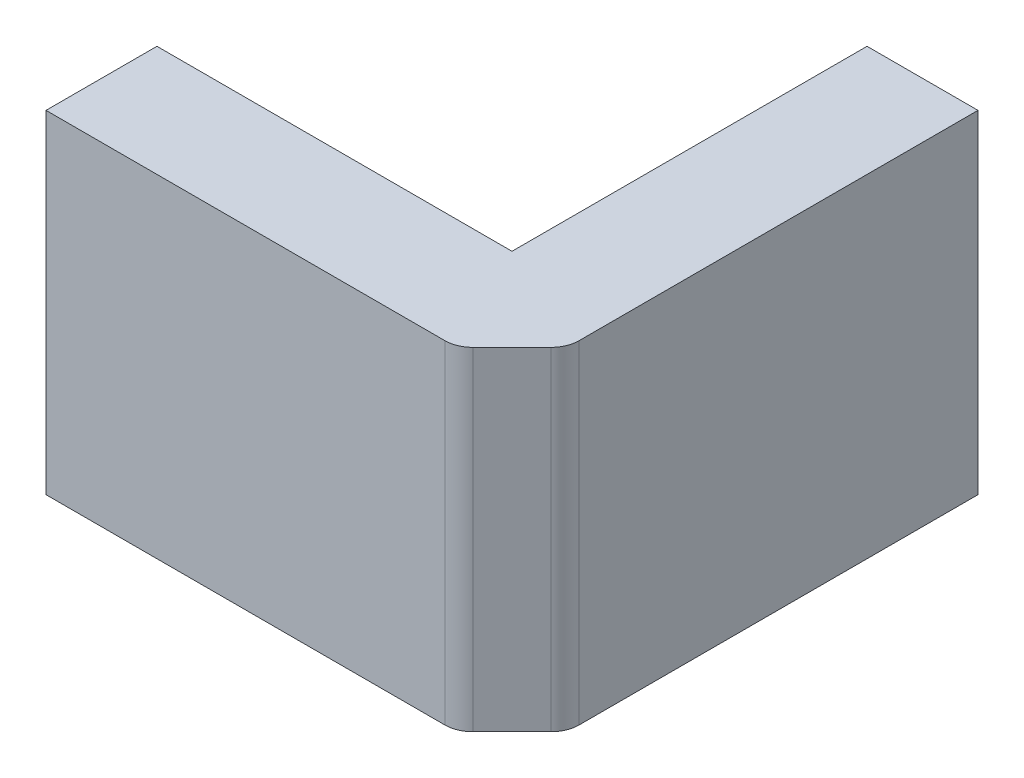
ISO-10303-21;
HEADER;
FILE_DESCRIPTION(('STEP AP214'),'2;1');
FILE_NAME('part.step','',(''),(''),'','','');
FILE_SCHEMA(('AUTOMOTIVE_DESIGN { 1 0 10303 214 1 1 1 1 }'));
ENDSEC;
DATA;
#1=APPLICATION_CONTEXT('core data for automotive mechanical design processes');
#2=APPLICATION_PROTOCOL_DEFINITION('international standard','automotive_design',2000,#1);
#3=PRODUCT_CONTEXT('',#1,'mechanical');
#4=PRODUCT('Part','Part','',(#3));
#5=PRODUCT_RELATED_PRODUCT_CATEGORY('part','',(#4));
#6=PRODUCT_DEFINITION_FORMATION('','',#4);
#7=PRODUCT_DEFINITION_CONTEXT('part definition',#1,'design');
#8=PRODUCT_DEFINITION('design','',#6,#7);
#9=PRODUCT_DEFINITION_SHAPE('','',#8);
#10=(LENGTH_UNIT() NAMED_UNIT(*) SI_UNIT(.MILLI.,.METRE.));
#11=(NAMED_UNIT(*) PLANE_ANGLE_UNIT() SI_UNIT($,.RADIAN.));
#12=(NAMED_UNIT(*) SI_UNIT($,.STERADIAN.) SOLID_ANGLE_UNIT());
#13=UNCERTAINTY_MEASURE_WITH_UNIT(LENGTH_MEASURE(1.E-05),#10,'distance_accuracy_value','');
#14=(GEOMETRIC_REPRESENTATION_CONTEXT(3) GLOBAL_UNCERTAINTY_ASSIGNED_CONTEXT((#13)) GLOBAL_UNIT_ASSIGNED_CONTEXT((#10,
#11,#12)) REPRESENTATION_CONTEXT('',''));
#15=CARTESIAN_POINT('',(0.,0.,0.));
#16=DIRECTION('',(0.,0.,1.));
#17=DIRECTION('',(1.,0.,0.));
#18=AXIS2_PLACEMENT_3D('',#15,#16,#17);
#19=CARTESIAN_POINT('',(42.,60.,42.));
#20=DIRECTION('',(-1.,0.,0.));
#21=DIRECTION('',(0.,0.,1.));
#22=AXIS2_PLACEMENT_3D('',#19,#20,#21);
#23=PLANE('',#22);
#24=DIRECTION('',(0.,0.,-1.));
#25=VECTOR('',#24,1.);
#26=CARTESIAN_POINT('',(42.,60.,42.));
#27=LINE('',#26,#25);
#28=CARTESIAN_POINT('',(42.,60.,29.9289321881345));
#29=VERTEX_POINT('',#28);
#30=CARTESIAN_POINT('',(42.,60.,-42.));
#31=VERTEX_POINT('',#30);
#32=EDGE_CURVE('E111',#29,#31,#27,.T.);
#33=ORIENTED_EDGE('',*,*,#32,.F.);
#34=DIRECTION('',(0.,1.,0.));
#35=VECTOR('',#34,1.);
#36=CARTESIAN_POINT('',(42.,0.,29.9289321881345));
#37=LINE('',#36,#35);
#38=CARTESIAN_POINT('',(42.,0.,29.9289321881345));
#39=VERTEX_POINT('',#38);
#40=EDGE_CURVE('E145',#29,#39,#37,.F.);
#41=ORIENTED_EDGE('',*,*,#40,.T.);
#42=DIRECTION('',(0.,0.,-1.));
#43=VECTOR('',#42,1.);
#44=CARTESIAN_POINT('',(42.,0.,42.));
#45=LINE('',#44,#43);
#46=CARTESIAN_POINT('',(42.,0.,-42.));
#47=VERTEX_POINT('',#46);
#48=EDGE_CURVE('E133',#39,#47,#45,.T.);
#49=ORIENTED_EDGE('',*,*,#48,.T.);
#50=DIRECTION('',(0.,-1.,0.));
#51=VECTOR('',#50,1.);
#52=CARTESIAN_POINT('',(42.,60.,-42.));
#53=LINE('',#52,#51);
#54=EDGE_CURVE('E126',#31,#47,#53,.T.);
#55=ORIENTED_EDGE('',*,*,#54,.F.);
#56=EDGE_LOOP('',(#33,#41,#49,#55));
#57=FACE_BOUND('',#56,.T.);
#58=ADVANCED_FACE('F39',(#57),#23,.F.);
#59=CARTESIAN_POINT('',(22.,60.,-42.));
#60=DIRECTION('',(0.,0.,1.));
#61=DIRECTION('',(1.,0.,0.));
#62=AXIS2_PLACEMENT_3D('',#59,#60,#61);
#63=PLANE('',#62);
#64=DIRECTION('',(-1.,0.,0.));
#65=VECTOR('',#64,1.);
#66=CARTESIAN_POINT('',(22.,0.,-42.));
#67=LINE('',#66,#65);
#68=CARTESIAN_POINT('',(22.,0.,-42.));
#69=VERTEX_POINT('',#68);
#70=EDGE_CURVE('E189',#47,#69,#67,.T.);
#71=ORIENTED_EDGE('',*,*,#70,.T.);
#72=DIRECTION('',(0.,-1.,0.));
#73=VECTOR('',#72,1.);
#74=CARTESIAN_POINT('',(22.,60.,-42.));
#75=LINE('',#74,#73);
#76=CARTESIAN_POINT('',(22.,60.,-42.));
#77=VERTEX_POINT('',#76);
#78=EDGE_CURVE('E128',#77,#69,#75,.T.);
#79=ORIENTED_EDGE('',*,*,#78,.F.);
#80=DIRECTION('',(-1.,0.,0.));
#81=VECTOR('',#80,1.);
#82=CARTESIAN_POINT('',(22.,60.,-42.));
#83=LINE('',#82,#81);
#84=EDGE_CURVE('E114',#31,#77,#83,.T.);
#85=ORIENTED_EDGE('',*,*,#84,.F.);
#86=ORIENTED_EDGE('',*,*,#54,.T.);
#87=EDGE_LOOP('',(#71,#79,#85,#86));
#88=FACE_BOUND('',#87,.T.);
#89=ADVANCED_FACE('F125',(#88),#63,.F.);
#90=CARTESIAN_POINT('',(22.,60.,-42.));
#91=DIRECTION('',(1.,0.,0.));
#92=DIRECTION('',(0.,0.,-1.));
#93=AXIS2_PLACEMENT_3D('',#90,#91,#92);
#94=PLANE('',#93);
#95=DIRECTION('',(0.,0.,1.));
#96=VECTOR('',#95,1.);
#97=CARTESIAN_POINT('',(22.,0.,-42.));
#98=LINE('',#97,#96);
#99=CARTESIAN_POINT('',(22.,0.,22.));
#100=VERTEX_POINT('',#99);
#101=EDGE_CURVE('E188',#69,#100,#98,.T.);
#102=ORIENTED_EDGE('',*,*,#101,.T.);
#103=DIRECTION('',(0.,-1.,0.));
#104=VECTOR('',#103,1.);
#105=CARTESIAN_POINT('',(22.,60.,22.));
#106=LINE('',#105,#104);
#107=CARTESIAN_POINT('',(22.,60.,22.));
#108=VERTEX_POINT('',#107);
#109=EDGE_CURVE('E140',#108,#100,#106,.T.);
#110=ORIENTED_EDGE('',*,*,#109,.F.);
#111=DIRECTION('',(0.,0.,1.));
#112=VECTOR('',#111,1.);
#113=CARTESIAN_POINT('',(22.,60.,-42.));
#114=LINE('',#113,#112);
#115=EDGE_CURVE('E130',#77,#108,#114,.T.);
#116=ORIENTED_EDGE('',*,*,#115,.F.);
#117=ORIENTED_EDGE('',*,*,#78,.T.);
#118=EDGE_LOOP('',(#102,#110,#116,#117));
#119=FACE_BOUND('',#118,.T.);
#120=ADVANCED_FACE('F198',(#119),#94,.F.);
#121=CARTESIAN_POINT('',(22.,60.,22.));
#122=DIRECTION('',(0.,0.,1.));
#123=DIRECTION('',(1.,0.,0.));
#124=AXIS2_PLACEMENT_3D('',#121,#122,#123);
#125=PLANE('',#124);
#126=DIRECTION('',(-1.,0.,0.));
#127=VECTOR('',#126,1.);
#128=CARTESIAN_POINT('',(22.,0.,22.));
#129=LINE('',#128,#127);
#130=CARTESIAN_POINT('',(-42.,0.,22.));
#131=VERTEX_POINT('',#130);
#132=EDGE_CURVE('E171',#100,#131,#129,.T.);
#133=ORIENTED_EDGE('',*,*,#132,.T.);
#134=DIRECTION('',(0.,-1.,0.));
#135=VECTOR('',#134,1.);
#136=CARTESIAN_POINT('',(-42.,60.,22.));
#137=LINE('',#136,#135);
#138=CARTESIAN_POINT('',(-42.,60.,22.));
#139=VERTEX_POINT('',#138);
#140=EDGE_CURVE('E176',#139,#131,#137,.T.);
#141=ORIENTED_EDGE('',*,*,#140,.F.);
#142=DIRECTION('',(-1.,0.,0.));
#143=VECTOR('',#142,1.);
#144=CARTESIAN_POINT('',(22.,60.,22.));
#145=LINE('',#144,#143);
#146=EDGE_CURVE('E185',#108,#139,#145,.T.);
#147=ORIENTED_EDGE('',*,*,#146,.F.);
#148=ORIENTED_EDGE('',*,*,#109,.T.);
#149=EDGE_LOOP('',(#133,#141,#147,#148));
#150=FACE_BOUND('',#149,.T.);
#151=ADVANCED_FACE('F183',(#150),#125,.F.);
#152=CARTESIAN_POINT('',(-42.,60.,42.));
#153=DIRECTION('',(1.,0.,0.));
#154=DIRECTION('',(0.,0.,-1.));
#155=AXIS2_PLACEMENT_3D('',#152,#153,#154);
#156=PLANE('',#155);
#157=DIRECTION('',(0.,0.,1.));
#158=VECTOR('',#157,1.);
#159=CARTESIAN_POINT('',(-42.,0.,42.));
#160=LINE('',#159,#158);
#161=CARTESIAN_POINT('',(-42.,0.,42.));
#162=VERTEX_POINT('',#161);
#163=EDGE_CURVE('E169',#131,#162,#160,.T.);
#164=ORIENTED_EDGE('',*,*,#163,.T.);
#165=DIRECTION('',(0.,-1.,0.));
#166=VECTOR('',#165,1.);
#167=CARTESIAN_POINT('',(-42.,60.,42.));
#168=LINE('',#167,#166);
#169=CARTESIAN_POINT('',(-42.,60.,42.));
#170=VERTEX_POINT('',#169);
#171=EDGE_CURVE('E168',#170,#162,#168,.T.);
#172=ORIENTED_EDGE('',*,*,#171,.F.);
#173=DIRECTION('',(0.,0.,1.));
#174=VECTOR('',#173,1.);
#175=CARTESIAN_POINT('',(-42.,60.,42.));
#176=LINE('',#175,#174);
#177=EDGE_CURVE('E195',#139,#170,#176,.T.);
#178=ORIENTED_EDGE('',*,*,#177,.F.);
#179=ORIENTED_EDGE('',*,*,#140,.T.);
#180=EDGE_LOOP('',(#164,#172,#178,#179));
#181=FACE_BOUND('',#180,.T.);
#182=ADVANCED_FACE('F205',(#181),#156,.F.);
#183=CARTESIAN_POINT('',(-42.,60.,42.));
#184=DIRECTION('',(0.,0.,-1.));
#185=DIRECTION('',(-1.,0.,0.));
#186=AXIS2_PLACEMENT_3D('',#183,#184,#185);
#187=PLANE('',#186);
#188=DIRECTION('',(1.,0.,0.));
#189=VECTOR('',#188,1.);
#190=CARTESIAN_POINT('',(-42.,0.,42.));
#191=LINE('',#190,#189);
#192=CARTESIAN_POINT('',(29.9289321881345,0.,42.));
#193=VERTEX_POINT('',#192);
#194=EDGE_CURVE('E121',#162,#193,#191,.T.);
#195=ORIENTED_EDGE('',*,*,#194,.T.);
#196=DIRECTION('',(0.,-1.,0.));
#197=VECTOR('',#196,1.);
#198=CARTESIAN_POINT('',(29.9289321881345,60.,42.));
#199=LINE('',#198,#197);
#200=CARTESIAN_POINT('',(29.9289321881345,60.,42.));
#201=VERTEX_POINT('',#200);
#202=EDGE_CURVE('E11',#193,#201,#199,.F.);
#203=ORIENTED_EDGE('',*,*,#202,.T.);
#204=DIRECTION('',(1.,0.,0.));
#205=VECTOR('',#204,1.);
#206=CARTESIAN_POINT('',(-42.,60.,42.));
#207=LINE('',#206,#205);
#208=EDGE_CURVE('E156',#170,#201,#207,.T.);
#209=ORIENTED_EDGE('',*,*,#208,.F.);
#210=ORIENTED_EDGE('',*,*,#171,.T.);
#211=EDGE_LOOP('',(#195,#203,#209,#210));
#212=FACE_BOUND('',#211,.T.);
#213=ADVANCED_FACE('F166',(#212),#187,.F.);
#214=CARTESIAN_POINT('',(0.,60.,0.));
#215=DIRECTION('',(0.,-1.,0.));
#216=DIRECTION('',(0.,0.,-1.));
#217=AXIS2_PLACEMENT_3D('',#214,#215,#216);
#218=PLANE('',#217);
#219=DIRECTION('',(-0.707106781186549,0.,0.707106781186546));
#220=VECTOR('',#219,1.);
#221=CARTESIAN_POINT('',(42.,60.,32.));
#222=LINE('',#221,#220);
#223=CARTESIAN_POINT('',(33.4644660940672,60.,40.5355339059328));
#224=VERTEX_POINT('',#223);
#225=CARTESIAN_POINT('',(40.5355339059328,60.,33.4644660940672));
#226=VERTEX_POINT('',#225);
#227=EDGE_CURVE('E138',#224,#226,#222,.F.);
#228=ORIENTED_EDGE('',*,*,#227,.T.);
#229=CARTESIAN_POINT('',(37.,60.,29.9289321881345));
#230=DIRECTION('',(0.,-1.,0.));
#231=DIRECTION('',(0.,0.,-1.));
#232=AXIS2_PLACEMENT_3D('',#229,#230,#231);
#233=CIRCLE('',#232,5.);
#234=EDGE_CURVE('E47',#226,#29,#233,.F.);
#235=ORIENTED_EDGE('',*,*,#234,.T.);
#236=ORIENTED_EDGE('',*,*,#32,.T.);
#237=ORIENTED_EDGE('',*,*,#84,.T.);
#238=ORIENTED_EDGE('',*,*,#115,.T.);
#239=ORIENTED_EDGE('',*,*,#146,.T.);
#240=ORIENTED_EDGE('',*,*,#177,.T.);
#241=ORIENTED_EDGE('',*,*,#208,.T.);
#242=CARTESIAN_POINT('',(29.9289321881345,60.,37.));
#243=DIRECTION('',(0.,-1.,0.));
#244=DIRECTION('',(0.,0.,-1.));
#245=AXIS2_PLACEMENT_3D('',#242,#243,#244);
#246=CIRCLE('',#245,5.);
#247=EDGE_CURVE('E54',#201,#224,#246,.F.);
#248=ORIENTED_EDGE('',*,*,#247,.T.);
#249=EDGE_LOOP('',(#228,#235,#236,#237,#238,#239,#240,#241,#248));
#250=FACE_BOUND('',#249,.T.);
#251=ADVANCED_FACE('F113',(#250),#218,.F.);
#252=CARTESIAN_POINT('',(0.,0.,0.));
#253=DIRECTION('',(0.,-1.,0.));
#254=DIRECTION('',(0.,0.,-1.));
#255=AXIS2_PLACEMENT_3D('',#252,#253,#254);
#256=PLANE('',#255);
#257=ORIENTED_EDGE('',*,*,#48,.F.);
#258=CARTESIAN_POINT('',(37.,0.,29.9289321881345));
#259=DIRECTION('',(0.,-1.,0.));
#260=DIRECTION('',(0.,0.,-1.));
#261=AXIS2_PLACEMENT_3D('',#258,#259,#260);
#262=CIRCLE('',#261,5.);
#263=CARTESIAN_POINT('',(40.5355339059328,0.,33.4644660940672));
#264=VERTEX_POINT('',#263);
#265=EDGE_CURVE('E149',#39,#264,#262,.T.);
#266=ORIENTED_EDGE('',*,*,#265,.T.);
#267=DIRECTION('',(0.707106781186549,0.,-0.707106781186546));
#268=VECTOR('',#267,1.);
#269=CARTESIAN_POINT('',(36.9999999999999,0.,37.0000000000001));
#270=LINE('',#269,#268);
#271=CARTESIAN_POINT('',(33.4644660940672,0.,40.5355339059327));
#272=VERTEX_POINT('',#271);
#273=EDGE_CURVE('E135',#264,#272,#270,.F.);
#274=ORIENTED_EDGE('',*,*,#273,.T.);
#275=CARTESIAN_POINT('',(29.9289321881345,0.,37.));
#276=DIRECTION('',(0.,-1.,0.));
#277=DIRECTION('',(0.,0.,-1.));
#278=AXIS2_PLACEMENT_3D('',#275,#276,#277);
#279=CIRCLE('',#278,5.);
#280=EDGE_CURVE('E147',#272,#193,#279,.T.);
#281=ORIENTED_EDGE('',*,*,#280,.T.);
#282=ORIENTED_EDGE('',*,*,#194,.F.);
#283=ORIENTED_EDGE('',*,*,#163,.F.);
#284=ORIENTED_EDGE('',*,*,#132,.F.);
#285=ORIENTED_EDGE('',*,*,#101,.F.);
#286=ORIENTED_EDGE('',*,*,#70,.F.);
#287=EDGE_LOOP('',(#257,#266,#274,#281,#282,#283,#284,#285,#286));
#288=FACE_BOUND('',#287,.T.);
#289=ADVANCED_FACE('F162',(#288),#256,.T.);
#290=CARTESIAN_POINT('',(42.,60.,32.));
#291=DIRECTION('',(-0.707106781186546,0.,-0.707106781186549));
#292=DIRECTION('',(0.,-1.,0.));
#293=AXIS2_PLACEMENT_3D('',#290,#291,#292);
#294=PLANE('',#293);
#295=ORIENTED_EDGE('',*,*,#273,.F.);
#296=DIRECTION('',(0.,-1.,0.));
#297=VECTOR('',#296,1.);
#298=CARTESIAN_POINT('',(40.5355339059328,60.,33.4644660940672));
#299=LINE('',#298,#297);
#300=EDGE_CURVE('E61',#264,#226,#299,.F.);
#301=ORIENTED_EDGE('',*,*,#300,.T.);
#302=ORIENTED_EDGE('',*,*,#227,.F.);
#303=DIRECTION('',(0.,1.,0.));
#304=VECTOR('',#303,1.);
#305=CARTESIAN_POINT('',(33.4644660940672,0.,40.5355339059328));
#306=LINE('',#305,#304);
#307=EDGE_CURVE('E151',#224,#272,#306,.F.);
#308=ORIENTED_EDGE('',*,*,#307,.T.);
#309=EDGE_LOOP('',(#295,#301,#302,#308));
#310=FACE_BOUND('',#309,.T.);
#311=ADVANCED_FACE('F157',(#310),#294,.F.);
#312=CARTESIAN_POINT('',(37.,60.,29.9289321881345));
#313=DIRECTION('',(0.,-1.,0.));
#314=DIRECTION('',(0.,0.,-1.));
#315=AXIS2_PLACEMENT_3D('',#312,#313,#314);
#316=CYLINDRICAL_SURFACE('',#315,5.);
#317=ORIENTED_EDGE('',*,*,#234,.F.);
#318=ORIENTED_EDGE('',*,*,#300,.F.);
#319=ORIENTED_EDGE('',*,*,#265,.F.);
#320=ORIENTED_EDGE('',*,*,#40,.F.);
#321=EDGE_LOOP('',(#317,#318,#319,#320));
#322=FACE_BOUND('',#321,.T.);
#323=ADVANCED_FACE('F219',(#322),#316,.T.);
#324=CARTESIAN_POINT('',(29.9289321881345,60.,37.));
#325=DIRECTION('',(0.,1.,0.));
#326=DIRECTION('',(0.,0.,1.));
#327=AXIS2_PLACEMENT_3D('',#324,#325,#326);
#328=CYLINDRICAL_SURFACE('',#327,5.);
#329=ORIENTED_EDGE('',*,*,#280,.F.);
#330=ORIENTED_EDGE('',*,*,#307,.F.);
#331=ORIENTED_EDGE('',*,*,#247,.F.);
#332=ORIENTED_EDGE('',*,*,#202,.F.);
#333=EDGE_LOOP('',(#329,#330,#331,#332));
#334=FACE_BOUND('',#333,.T.);
#335=ADVANCED_FACE('F41',(#334),#328,.T.);
#336=CLOSED_SHELL('',(#58,#89,#120,#151,#182,#213,#251,#289,#311,#323,#335));
#337=MANIFOLD_SOLID_BREP('B2',#336);
#338=ADVANCED_BREP_SHAPE_REPRESENTATION('',(#18,#337),#14);
#339=SHAPE_DEFINITION_REPRESENTATION(#9,#338);
ENDSEC;
END-ISO-10303-21;
